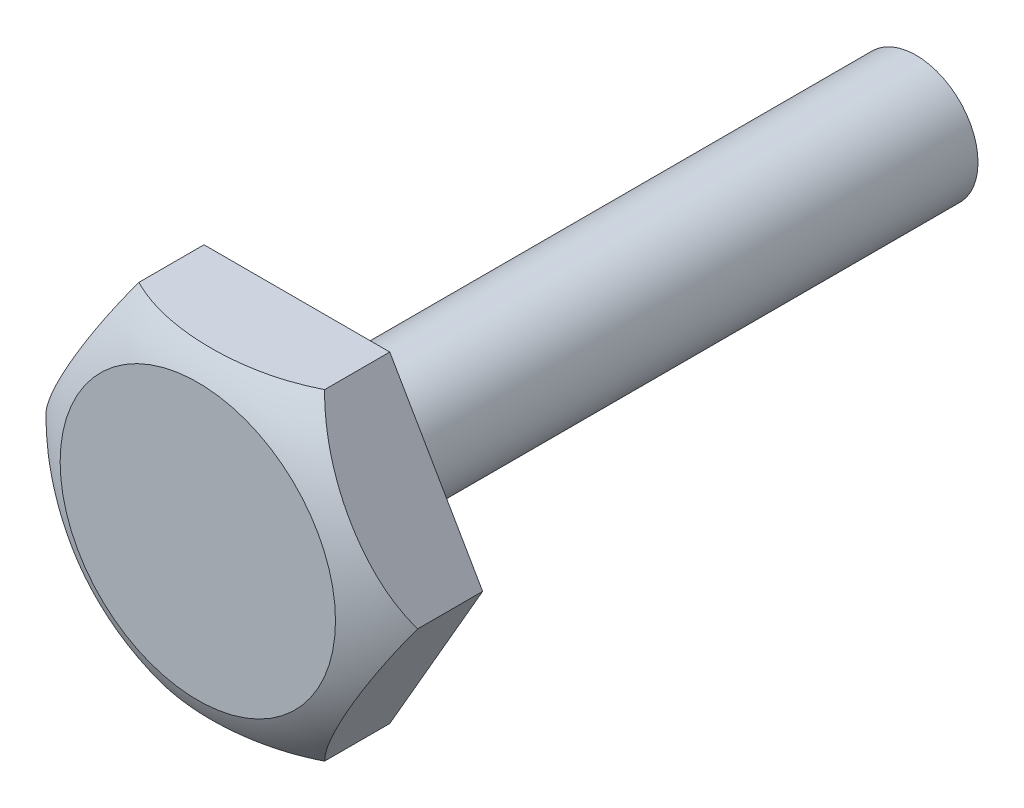
ISO-10303-21;
HEADER;
FILE_DESCRIPTION(('STEP AP214'),'2;1');
FILE_NAME('part.step','',(''),(''),'','','');
FILE_SCHEMA(('AUTOMOTIVE_DESIGN { 1 0 10303 214 1 1 1 1 }'));
ENDSEC;
DATA;
#1=APPLICATION_CONTEXT('core data for automotive mechanical design processes');
#2=APPLICATION_PROTOCOL_DEFINITION('international standard','automotive_design',2000,#1);
#3=PRODUCT_CONTEXT('',#1,'mechanical');
#4=PRODUCT('Part','Part','',(#3));
#5=PRODUCT_RELATED_PRODUCT_CATEGORY('part','',(#4));
#6=PRODUCT_DEFINITION_FORMATION('','',#4);
#7=PRODUCT_DEFINITION_CONTEXT('part definition',#1,'design');
#8=PRODUCT_DEFINITION('design','',#6,#7);
#9=PRODUCT_DEFINITION_SHAPE('','',#8);
#10=(LENGTH_UNIT() NAMED_UNIT(*) SI_UNIT(.MILLI.,.METRE.));
#11=(NAMED_UNIT(*) PLANE_ANGLE_UNIT() SI_UNIT($,.RADIAN.));
#12=(NAMED_UNIT(*) SI_UNIT($,.STERADIAN.) SOLID_ANGLE_UNIT());
#13=UNCERTAINTY_MEASURE_WITH_UNIT(LENGTH_MEASURE(1.E-05),#10,'distance_accuracy_value','');
#14=(GEOMETRIC_REPRESENTATION_CONTEXT(3) GLOBAL_UNCERTAINTY_ASSIGNED_CONTEXT((#13)) GLOBAL_UNIT_ASSIGNED_CONTEXT((#10,
#11,#12)) REPRESENTATION_CONTEXT('',''));
#15=CARTESIAN_POINT('',(0.,0.,0.));
#16=DIRECTION('',(0.,0.,1.));
#17=DIRECTION('',(1.,0.,0.));
#18=AXIS2_PLACEMENT_3D('',#15,#16,#17);
#19=CARTESIAN_POINT('',(3.75000000000008,-6.49519052838325,4.));
#20=DIRECTION('',(-0.866025403784441,0.499999999999995,0.));
#21=DIRECTION('',(-0.499999999999995,-0.866025403784442,0.));
#22=AXIS2_PLACEMENT_3D('',#19,#20,#21);
#23=PLANE('',#22);
#24=DIRECTION('',(0.,0.,-1.));
#25=VECTOR('',#24,1.);
#26=CARTESIAN_POINT('',(7.5,0.,4.));
#27=LINE('',#26,#25);
#28=CARTESIAN_POINT('',(7.49999999999999,0.,2.62939819100029));
#29=VERTEX_POINT('',#28);
#30=CARTESIAN_POINT('',(7.5,0.,0.));
#31=VERTEX_POINT('',#30);
#32=EDGE_CURVE('E11',#29,#31,#27,.T.);
#33=ORIENTED_EDGE('',*,*,#32,.F.);
#34=CARTESIAN_POINT('',(7.50011547005384,0.000199999999999211,2.62927962667923));
#35=CARTESIAN_POINT('',(7.4168632563686,-0.143997063945415,2.71476815559064));
#36=CARTESIAN_POINT('',(7.33185595866303,-0.291234022585602,2.7930783197184));
#37=CARTESIAN_POINT('',(7.1591001834199,-0.590455802607645,2.93585596921395));
#38=CARTESIAN_POINT('',(7.07135526733453,-0.742434455373376,3.00034064552003));
#39=CARTESIAN_POINT('',(6.80471411859253,-1.20427047238307,3.17420321588138));
#40=CARTESIAN_POINT('',(6.6225358274277,-1.51981252871663,3.26386574604815));
#41=CARTESIAN_POINT('',(6.30942279541368,-2.06214020867685,3.37582623012344));
#42=CARTESIAN_POINT('',(6.17948309488391,-2.28720237191471,3.41025736985663));
#43=CARTESIAN_POINT('',(5.91855813859982,-2.73913765316144,3.45715839331436));
#44=CARTESIAN_POINT('',(5.78757257588217,-2.96601130284642,3.46962157208918));
#45=CARTESIAN_POINT('',(5.52549936277508,-3.41993542325073,3.47307988867929));
#46=CARTESIAN_POINT('',(5.39441169553681,-3.6469859231531,3.46406993174504));
#47=CARTESIAN_POINT('',(5.13312913421654,-4.09954059449154,3.42420879852374));
#48=CARTESIAN_POINT('',(5.00293402120444,-4.32504514512568,3.39336318696253));
#49=CARTESIAN_POINT('',(4.67864015370606,-4.88673860021589,3.28702097901748));
#50=CARTESIAN_POINT('',(4.48562748867411,-5.2210463425555,3.19681149726034));
#51=CARTESIAN_POINT('',(4.20328912367753,-5.71007073565551,3.01784692902771));
#52=CARTESIAN_POINT('',(4.11041933985091,-5.87092591973116,2.95096292528329));
#53=CARTESIAN_POINT('',(3.927674798482,-6.18744875018799,2.80183087467424));
#54=CARTESIAN_POINT('',(3.83780440833829,-6.34310883201292,2.71956148497344));
#55=CARTESIAN_POINT('',(3.74988452994623,-6.49539052838325,2.62927962667928));
#56=B_SPLINE_CURVE_WITH_KNOTS('',3,(#34,#35,#36,#37,#38,#39,#40,#41,#42,#43,#44,#45,#46,#47,#48,
#49,#50,#51,#52,#53,#54,#55),.UNSPECIFIED.,.F.,.F.,(4,2,2,2,2,2,2,2,2,2,4),(0.,0.56107497083197,
1.12144818888939,2.24301953120071,3.0286600012569,3.81454021902151,4.60060691450929,
5.38647335625081,6.57098986097647,7.16263572576022,7.75510850182308),.UNSPECIFIED.);
#57=CARTESIAN_POINT('',(3.75000000000008,-6.49519052838325,2.62939819100028));
#58=VERTEX_POINT('',#57);
#59=EDGE_CURVE('E86',#29,#58,#56,.T.);
#60=ORIENTED_EDGE('',*,*,#59,.T.);
#61=DIRECTION('',(0.,0.,-1.));
#62=VECTOR('',#61,1.);
#63=CARTESIAN_POINT('',(3.75000000000008,-6.49519052838325,4.));
#64=LINE('',#63,#62);
#65=CARTESIAN_POINT('',(3.75000000000008,-6.49519052838325,0.));
#66=VERTEX_POINT('',#65);
#67=EDGE_CURVE('E56',#58,#66,#64,.T.);
#68=ORIENTED_EDGE('',*,*,#67,.T.);
#69=DIRECTION('',(0.499999999999995,0.866025403784441,0.));
#70=VECTOR('',#69,1.);
#71=CARTESIAN_POINT('',(3.75000000000008,-6.49519052838325,0.));
#72=LINE('',#71,#70);
#73=EDGE_CURVE('E126',#66,#31,#72,.T.);
#74=ORIENTED_EDGE('',*,*,#73,.T.);
#75=EDGE_LOOP('',(#33,#60,#68,#74));
#76=FACE_BOUND('',#75,.T.);
#77=ADVANCED_FACE('F32',(#76),#23,.F.);
#78=CARTESIAN_POINT('',(7.5,0.,4.));
#79=DIRECTION('',(-0.866025403784438,-0.500000000000001,0.));
#80=DIRECTION('',(0.500000000000001,-0.866025403784438,0.));
#81=AXIS2_PLACEMENT_3D('',#78,#79,#80);
#82=PLANE('',#81);
#83=DIRECTION('',(0.,0.,-1.));
#84=VECTOR('',#83,1.);
#85=CARTESIAN_POINT('',(3.74999999999998,6.4951905283833,4.));
#86=LINE('',#85,#84);
#87=CARTESIAN_POINT('',(3.75000000000342,6.4951905283833,2.62939819099851));
#88=VERTEX_POINT('',#87);
#89=CARTESIAN_POINT('',(3.74999999999998,6.4951905283833,0.));
#90=VERTEX_POINT('',#89);
#91=EDGE_CURVE('E41',#88,#90,#86,.T.);
#92=ORIENTED_EDGE('',*,*,#91,.F.);
#93=CARTESIAN_POINT('',(3.74988452994615,6.4953905283833,2.62927962667923));
#94=CARTESIAN_POINT('',(3.83313674363139,6.35119346443788,2.71476815559064));
#95=CARTESIAN_POINT('',(3.91814404133696,6.2039565057977,2.7930783197184));
#96=CARTESIAN_POINT('',(4.09089981658008,5.90473472577566,2.93585596921396));
#97=CARTESIAN_POINT('',(4.17864473266545,5.75275607300993,3.00034064552004));
#98=CARTESIAN_POINT('',(4.44528588140746,5.29092005600024,3.17420321588138));
#99=CARTESIAN_POINT('',(4.62746417257229,4.97537799966668,3.26386574604816));
#100=CARTESIAN_POINT('',(4.94057720458632,4.43305031970645,3.37582623012345));
#101=CARTESIAN_POINT('',(5.07051690511609,4.20798815646859,3.41025736985664));
#102=CARTESIAN_POINT('',(5.33144186140018,3.75605287522187,3.45715839331438));
#103=CARTESIAN_POINT('',(5.46242742411784,3.52917922553688,3.4696215720892));
#104=CARTESIAN_POINT('',(5.72450063722493,3.07525510513258,3.47307988867931));
#105=CARTESIAN_POINT('',(5.8555883044632,2.84820460523021,3.46406993174506));
#106=CARTESIAN_POINT('',(6.11687086578347,2.39564993389177,3.42420879852376));
#107=CARTESIAN_POINT('',(6.24706597879558,2.17014538325763,3.39336318696255));
#108=CARTESIAN_POINT('',(6.57135984629397,1.60845192816741,3.2870209790175));
#109=CARTESIAN_POINT('',(6.76437251132593,1.27414418582779,3.19681149726036));
#110=CARTESIAN_POINT('',(7.04671087632252,0.78511979272776,3.01784692902772));
#111=CARTESIAN_POINT('',(7.13958066014915,0.62426460865211,2.9509629252833));
#112=CARTESIAN_POINT('',(7.32232520151807,0.307741778195267,2.80183087467425));
#113=CARTESIAN_POINT('',(7.41219559166178,0.152081696370327,2.71956148497344));
#114=CARTESIAN_POINT('',(7.50011547005384,-0.000200000000005981,2.62927962667928));
#115=B_SPLINE_CURVE_WITH_KNOTS('',3,(#93,#94,#95,#96,#97,#98,#99,#100,#101,#102,#103,#104,#105,
#106,#107,#108,#109,#110,#111,#112,#113,#114),.UNSPECIFIED.,.F.,.F.,(4,2,2,2,2,2,2,2,2,2,4),(0.,
0.561074970831971,1.12144818888939,2.24301953120071,3.02866000125691,3.81454021902152,
4.6006069145093,5.38647335625082,6.57098986097653,7.1626357257603,7.75510850182317),.UNSPECIFIED.);
#116=EDGE_CURVE('E93',#88,#29,#115,.T.);
#117=ORIENTED_EDGE('',*,*,#116,.T.);
#118=ORIENTED_EDGE('',*,*,#32,.T.);
#119=DIRECTION('',(-0.500000000000001,0.866025403784438,0.));
#120=VECTOR('',#119,1.);
#121=CARTESIAN_POINT('',(7.5,0.,0.));
#122=LINE('',#121,#120);
#123=EDGE_CURVE('E123',#31,#90,#122,.T.);
#124=ORIENTED_EDGE('',*,*,#123,.T.);
#125=EDGE_LOOP('',(#92,#117,#118,#124));
#126=FACE_BOUND('',#125,.T.);
#127=ADVANCED_FACE('F124',(#126),#82,.F.);
#128=CARTESIAN_POINT('',(3.74999999999998,6.4951905283833,4.));
#129=DIRECTION('',(0.,-1.,0.));
#130=DIRECTION('',(1.,0.,0.));
#131=AXIS2_PLACEMENT_3D('',#128,#129,#130);
#132=PLANE('',#131);
#133=DIRECTION('',(0.,0.,-1.));
#134=VECTOR('',#133,1.);
#135=CARTESIAN_POINT('',(-3.75000000000003,6.49519052838327,4.));
#136=LINE('',#135,#134);
#137=CARTESIAN_POINT('',(-3.75000000000004,6.49519052838326,2.62939819100029));
#138=VERTEX_POINT('',#137);
#139=CARTESIAN_POINT('',(-3.75000000000003,6.49519052838327,0.));
#140=VERTEX_POINT('',#139);
#141=EDGE_CURVE('E108',#138,#140,#136,.T.);
#142=ORIENTED_EDGE('',*,*,#141,.F.);
#143=CARTESIAN_POINT('',(0.,6.49519093423517,3.47155890128882));
#144=CARTESIAN_POINT('',(0.258969069792951,6.49519095337973,3.47155999350398));
#145=CARTESIAN_POINT('',(0.517955469303354,6.49519064467397,3.46107347610297));
#146=CARTESIAN_POINT('',(1.03411664575157,6.49519041206603,3.41872197818895));
#147=CARTESIAN_POINT('',(1.29129099515404,6.49519048825179,3.38685211260991));
#148=CARTESIAN_POINT('',(2.05567587491364,6.49519060828818,3.25752979588181));
#149=CARTESIAN_POINT('',(2.55808633477236,6.49519054526005,3.12638360706249));
#150=CARTESIAN_POINT('',(3.36177602403168,6.49519051717013,2.82216023809037));
#151=CARTESIAN_POINT('',(3.67397173256815,6.49519052633035,2.67792383583159));
#152=CARTESIAN_POINT('',(4.12186351488053,6.49519052941038,2.42547609187166));
#153=CARTESIAN_POINT('',(4.26780050577975,6.49519052865854,2.33527939174894));
#154=CARTESIAN_POINT('',(4.55144143610393,6.49519052810818,2.14280520622689));
#155=CARTESIAN_POINT('',(4.68914872378271,6.49519052830926,2.04053268496893));
#156=CARTESIAN_POINT('',(4.95611129637003,6.49519052845804,1.82302204747028));
#157=CARTESIAN_POINT('',(5.08527451851943,6.49519052840332,1.70767064563135));
#158=CARTESIAN_POINT('',(5.33204681255794,6.49519052836329,1.46530046963495));
#159=CARTESIAN_POINT('',(5.4496619593104,6.49519052837794,1.33828789862349));
#160=CARTESIAN_POINT('',(5.67180550403882,6.49519052838866,1.07329808959834));
#161=CARTESIAN_POINT('',(5.77633560552021,6.49519052838474,0.935322282689017));
#162=CARTESIAN_POINT('',(5.97079000768911,6.49519052838188,0.649438013516897));
#163=CARTESIAN_POINT('',(6.06071690611299,6.49519052838295,0.501531324471366));
#164=CARTESIAN_POINT('',(6.21332623462655,6.49519052838362,0.218030290201649));
#165=CARTESIAN_POINT('',(6.27805408110452,6.49519052838339,0.0835335692056448));
#166=CARTESIAN_POINT('',(6.39483489630915,6.49519052838323,-0.190849110927465));
#167=CARTESIAN_POINT('',(6.44688953267615,6.49519052838329,-0.330734358191222));
#168=CARTESIAN_POINT('',(6.53765454962487,6.49519052838333,-0.614689934226276));
#169=CARTESIAN_POINT('',(6.57637199741855,6.49519052838331,-0.758758002552336));
#170=CARTESIAN_POINT('',(6.64000402939573,6.4951905283833,-1.04991067649231));
#171=CARTESIAN_POINT('',(6.66491951013604,6.49519052838331,-1.19699508552506));
#172=CARTESIAN_POINT('',(6.69891588385024,6.49519052838331,-1.47868187709908));
#173=CARTESIAN_POINT('',(6.70928493807464,6.49519052838331,-1.61313033018025));
#174=CARTESIAN_POINT('',(6.71836976532784,6.49519052838331,-1.88246747303089));
#175=CARTESIAN_POINT('',(6.71708184497079,6.49519052838331,-2.01735628879163));
#176=CARTESIAN_POINT('',(6.7028604172302,6.49519052838331,-2.28643552133006));
#177=CARTESIAN_POINT('',(6.68993393069983,6.49519052838331,-2.42062631010796));
#178=CARTESIAN_POINT('',(6.65257883256612,6.49519052838331,-2.68744506090726));
#179=CARTESIAN_POINT('',(6.62814598083905,6.49519052838331,-2.82007242832113));
#180=CARTESIAN_POINT('',(6.56873956440933,6.49519052838331,-3.07966039288273));
#181=CARTESIAN_POINT('',(6.53402789892812,6.49519052838331,-3.20668088128766));
#182=CARTESIAN_POINT('',(6.45423458727956,6.49519052838331,-3.45743670218484));
#183=CARTESIAN_POINT('',(6.40914927739043,6.49519052838331,-3.58117085676076));
#184=CARTESIAN_POINT('',(6.25897532464976,6.49519052838331,-3.94613733601996));
#185=CARTESIAN_POINT('',(6.13891041249786,6.49519052838331,-4.18138488363264));
#186=CARTESIAN_POINT('',(5.85898094454624,6.49519052838331,-4.63721546700034));
#187=CARTESIAN_POINT('',(5.69795276567298,6.49519052838331,-4.85707627528596));
#188=CARTESIAN_POINT('',(5.34404693994348,6.4951905283833,-5.26938988649425));
#189=CARTESIAN_POINT('',(5.15116207403538,6.4951905283833,-5.46183645861714));
#190=CARTESIAN_POINT('',(4.72135130436639,6.4951905283833,-5.83277671193754));
#191=CARTESIAN_POINT('',(4.48202861756665,6.4951905283833,-6.00847921869226));
#192=CARTESIAN_POINT('',(3.98067346222279,6.4951905283833,-6.32372280388448));
#193=CARTESIAN_POINT('',(3.71862865093404,6.4951905283833,-6.46324406224017));
#194=CARTESIAN_POINT('',(3.2497105645913,6.4951905283833,-6.6751852391368));
#195=CARTESIAN_POINT('',(3.04637143158018,6.4951905283833,-6.75560831776356));
#196=CARTESIAN_POINT('',(2.63334565741563,6.49519052838329,-6.89831708459762));
#197=CARTESIAN_POINT('',(2.42365641031326,6.49519052838329,-6.96059521203973));
#198=CARTESIAN_POINT('',(1.99951909872226,6.49519052838329,-7.06811016100649));
#199=CARTESIAN_POINT('',(1.78506172387453,6.49519052838329,-7.11330983943059));
#200=CARTESIAN_POINT('',(1.35340584292705,6.49519052838329,-7.18748807411325));
#201=CARTESIAN_POINT('',(1.13620756418126,6.49519052838329,-7.21646796685261));
#202=CARTESIAN_POINT('',(0.695251142518523,6.49519052838329,-7.25948213161412));
#203=CARTESIAN_POINT('',(0.471457878176939,6.49519052838329,-7.27315331616981));
#204=CARTESIAN_POINT('',(0.0234585767996498,6.49519052838329,-7.28475860551752));
#205=CARTESIAN_POINT('',(-0.200747489936709,6.49519052838328,-7.28269152988778));
#206=CARTESIAN_POINT('',(-0.648323624051078,6.49519052838328,-7.26275131522971));
#207=CARTESIAN_POINT('',(-0.871694178721984,6.49519052838328,-7.24488960705426));
#208=CARTESIAN_POINT('',(-1.31643539871702,6.49519052838328,-7.1928606882892));
#209=CARTESIAN_POINT('',(-1.53780634573541,6.49519052838328,-7.15869581209195));
#210=CARTESIAN_POINT('',(-2.14405397389793,6.49519052838328,-7.0406109669356));
#211=CARTESIAN_POINT('',(-2.52577049350673,6.49519052838328,-6.93860543822306));
#212=CARTESIAN_POINT('',(-3.08208383166056,6.49519052838327,-6.7413229405459));
#213=CARTESIAN_POINT('',(-3.26475515061295,6.49519052838327,-6.66821374208926));
#214=CARTESIAN_POINT('',(-3.62318684535136,6.49519052838327,-6.50654858417446));
#215=CARTESIAN_POINT('',(-3.79894868736599,6.49519052838327,-6.41799592382293));
#216=CARTESIAN_POINT('',(-4.10897885662405,6.49519052838327,-6.24340769582508));
#217=CARTESIAN_POINT('',(-4.24478435859038,6.49519052838327,-6.16009258870633));
#218=CARTESIAN_POINT('',(-4.50940288339863,6.49519052838327,-5.98302775712828));
#219=CARTESIAN_POINT('',(-4.63821740337608,6.49519052838327,-5.88928028000844));
#220=CARTESIAN_POINT('',(-4.88771197312812,6.49519052838327,-5.69141266820533));
#221=CARTESIAN_POINT('',(-5.00838907411993,6.49519052838327,-5.58728880690669));
#222=CARTESIAN_POINT('',(-5.24025659129471,6.49519052838327,-5.36905169783457));
#223=CARTESIAN_POINT('',(-5.35145162164464,6.49519052838327,-5.25494336411499));
#224=CARTESIAN_POINT('',(-5.56393235309432,6.49519052838327,-5.01635043616324));
#225=CARTESIAN_POINT('',(-5.66514122996496,6.49519052838327,-4.89179726632481));
#226=CARTESIAN_POINT('',(-5.85545126302382,6.49519052838327,-4.63383442562589));
#227=CARTESIAN_POINT('',(-5.94455810667546,6.49519052838326,-4.50042895917169));
#228=CARTESIAN_POINT('',(-6.10954943152176,6.49519052838326,-4.22569052279737));
#229=CARTESIAN_POINT('',(-6.18543573307253,6.49519052838326,-4.08435864782442));
#230=CARTESIAN_POINT('',(-6.32295532458061,6.49519052838326,-3.79492608931995));
#231=CARTESIAN_POINT('',(-6.38459049083543,6.49519052838326,-3.64682629992724));
#232=CARTESIAN_POINT('',(-6.48642538056149,6.49519052838326,-3.36281902467063));
#233=CARTESIAN_POINT('',(-6.52828707440957,6.49519052838326,-3.22750519724051));
#234=CARTESIAN_POINT('',(-6.59975254584516,6.49519052838326,-2.95362135328283));
#235=CARTESIAN_POINT('',(-6.62935231232609,6.49519052838326,-2.81505028689088));
#236=CARTESIAN_POINT('',(-6.67590692428075,6.49519052838326,-2.53591061228801));
#237=CARTESIAN_POINT('',(-6.69287158841637,6.49519052838326,-2.39534364183388));
#238=CARTESIAN_POINT('',(-6.71399735555781,6.49519052838326,-2.11319599099732));
#239=CARTESIAN_POINT('',(-6.7181538906705,6.49519052838326,-1.97161496700192));
#240=CARTESIAN_POINT('',(-6.71374732339712,6.49519052838326,-1.69766928962382));
#241=CARTESIAN_POINT('',(-6.7059764429994,6.49519052838326,-1.56529121230037));
#242=CARTESIAN_POINT('',(-6.679232610204,6.49519052838327,-1.30162387859523));
#243=CARTESIAN_POINT('',(-6.66025577658161,6.49519052838328,-1.17033501545106));
#244=CARTESIAN_POINT('',(-6.61130509440032,6.49519052838324,-0.909895844195871));
#245=CARTESIAN_POINT('',(-6.58133688326408,6.49519052838319,-0.780744475201743));
#246=CARTESIAN_POINT('',(-6.51069660081557,6.49519052838334,-0.525356081721695));
#247=CARTESIAN_POINT('',(-6.47002053970753,6.49519052838354,-0.399120162656735));
#248=CARTESIAN_POINT('',(-6.37841813942033,6.49519052838299,-0.150570651755468));
#249=CARTESIAN_POINT('',(-6.32750256686276,6.49519052838223,-0.0282530951660894));
#250=CARTESIAN_POINT('',(-6.21589504006344,6.4951905283843,0.211853904525445));
#251=CARTESIAN_POINT('',(-6.15519960218179,6.49519052838713,0.329641715520424));
#252=CARTESIAN_POINT('',(-5.9592957298671,6.49519052837554,0.67508453494386));
#253=CARTESIAN_POINT('',(-5.8101907795019,6.49519052834108,0.895030790938366));
#254=CARTESIAN_POINT('',(-5.47157501216978,6.4951905284277,1.32059888779114));
#255=CARTESIAN_POINT('',(-5.28033163723046,6.49519052855717,1.52482851235643));
#256=CARTESIAN_POINT('',(-4.86943819780228,6.49519052820932,1.90224355175657));
#257=CARTESIAN_POINT('',(-4.64978028087344,6.49519052773183,2.0754203533695));
#258=CARTESIAN_POINT('',(-4.16199366567586,6.49519052911002,2.40777952145206));
#259=CARTESIAN_POINT('',(-3.89119711364582,6.49519053124179,2.56302988997838));
#260=CARTESIAN_POINT('',(-3.33083143935254,6.49519052552305,2.83437347560129));
#261=CARTESIAN_POINT('',(-3.04125124378215,6.4951905176666,2.95044334030363));
#262=CARTESIAN_POINT('',(-2.30493968614458,6.49519054435201,3.19397967667186));
#263=CARTESIAN_POINT('',(-1.8507428850566,6.49519060155952,3.29915368415554));
#264=CARTESIAN_POINT('',(-1.16158809674743,6.49519049164225,3.40317204053026));
#265=CARTESIAN_POINT('',(-0.930070910148221,6.49519042203226,3.42888484271053));
#266=CARTESIAN_POINT('',(-0.465707112361374,6.49519063472948,3.4630773910584));
#267=CARTESIAN_POINT('',(-0.23286056197811,6.49519091702072,3.47155791918762));
#268=CARTESIAN_POINT('',(0.,6.49519093423517,3.47155890128882));
#269=B_SPLINE_CURVE_WITH_KNOTS('',3,(#143,#144,#145,#146,#147,#148,#149,#150,#151,#152,#153,
#154,#155,#156,#157,#158,#159,#160,#161,#162,#163,#164,#165,#166,#167,#168,#169,#170,#171,#172,
#173,#174,#175,#176,#177,#178,#179,#180,#181,#182,#183,#184,#185,#186,#187,#188,#189,#190,#191,
#192,#193,#194,#195,#196,#197,#198,#199,#200,#201,#202,#203,#204,#205,#206,#207,#208,#209,#210,
#211,#212,#213,#214,#215,#216,#217,#218,#219,#220,#221,#222,#223,#224,#225,#226,#227,#228,#229,
#230,#231,#232,#233,#234,#235,#236,#237,#238,#239,#240,#241,#242,#243,#244,#245,#246,#247,#248,
#249,#250,#251,#252,#253,#254,#255,#256,#257,#258,#259,#260,#261,#262,#263,#264,#265,#266,#267,
#268),.UNSPECIFIED.,.T.,.F.,(4,2,2,2,2,2,2,2,2,2,2,2,2,2,2,2,2,2,2,2,2,2,2,2,2,2,2,2,2,2,2,2,2,
2,2,2,2,2,2,2,2,2,2,2,2,2,2,2,2,2,2,2,2,2,2,2,2,2,2,2,2,2,4),(0.,0.776652094276429,
1.55348167662068,3.1002088513003,4.12787714076711,4.64201462740926,5.15594149291401,
5.6747200261617,6.193224177226,6.71166075532702,7.2300050084534,7.67718284563839,
8.12430180781463,8.5711834813934,9.01803612274796,9.42208540946644,9.82626271929519,
10.2301963762821,10.6342790004226,11.0288415073095,11.4235435786657,12.2121834288833,
13.0263790023942,13.8407593347621,14.728040932914,15.6158075619041,16.2709654950617,
16.9263960348517,17.5832439446481,18.2400377234022,18.9120993913612,19.5842114666727,
20.2558375204128,20.9273674352618,22.107548915719,22.6972599043448,23.2868450700402,
23.7643719978953,24.2417962553871,24.7193925991098,25.1967551925475,25.6775428792768,
26.1581038276594,26.6385985545028,27.1190299835768,27.5434048251576,27.9679183783025,
28.3921016993389,28.8164362836823,29.2137808890204,29.6112631969672,30.0085419226647,
30.4059688863408,30.8029801288618,31.2001331027973,31.9937686535172,32.8297864954876,
33.6660358689334,34.5989559376517,35.5324310683581,36.9233858630535,37.6217698456402,
38.320122136434),.UNSPECIFIED.);
#270=EDGE_CURVE('E120',#138,#88,#269,.T.);
#271=ORIENTED_EDGE('',*,*,#270,.T.);
#272=ORIENTED_EDGE('',*,*,#91,.T.);
#273=DIRECTION('',(-1.,0.,0.));
#274=VECTOR('',#273,1.);
#275=CARTESIAN_POINT('',(3.74999999999998,6.4951905283833,0.));
#276=LINE('',#275,#274);
#277=EDGE_CURVE('E118',#90,#140,#276,.T.);
#278=ORIENTED_EDGE('',*,*,#277,.T.);
#279=EDGE_LOOP('',(#142,#271,#272,#278));
#280=FACE_BOUND('',#279,.T.);
#281=ADVANCED_FACE('F116',(#280),#132,.F.);
#282=CARTESIAN_POINT('',(-3.75000000000003,6.49519052838327,4.));
#283=DIRECTION('',(0.866025403784442,-0.499999999999995,0.));
#284=DIRECTION('',(0.499999999999995,0.866025403784442,0.));
#285=AXIS2_PLACEMENT_3D('',#282,#283,#284);
#286=PLANE('',#285);
#287=DIRECTION('',(0.,0.,-1.));
#288=VECTOR('',#287,1.);
#289=CARTESIAN_POINT('',(-7.5,0.,4.));
#290=LINE('',#289,#288);
#291=CARTESIAN_POINT('',(-7.49999999999999,0.,2.62939819100029));
#292=VERTEX_POINT('',#291);
#293=CARTESIAN_POINT('',(-7.5,0.,0.));
#294=VERTEX_POINT('',#293);
#295=EDGE_CURVE('E101',#292,#294,#290,.T.);
#296=ORIENTED_EDGE('',*,*,#295,.F.);
#297=CARTESIAN_POINT('',(-7.50011547005384,-0.000200000000051757,2.62927962667923));
#298=CARTESIAN_POINT('',(-7.4168632563686,0.143997063945362,2.71476815559064));
#299=CARTESIAN_POINT('',(-7.33185595866303,0.291234022585548,2.7930783197184));
#300=CARTESIAN_POINT('',(-7.1591001834199,0.59045580260759,2.93585596921396));
#301=CARTESIAN_POINT('',(-7.07135526733453,0.742434455373322,3.00034064552004));
#302=CARTESIAN_POINT('',(-6.80471411859253,1.20427047238301,3.17420321588138));
#303=CARTESIAN_POINT('',(-6.6225358274277,1.51981252871657,3.26386574604816));
#304=CARTESIAN_POINT('',(-6.30942279541368,2.0621402086768,3.37582623012345));
#305=CARTESIAN_POINT('',(-6.17948309488391,2.28720237191466,3.41025736985664));
#306=CARTESIAN_POINT('',(-5.91855813859982,2.73913765316139,3.45715839331438));
#307=CARTESIAN_POINT('',(-5.78757257588217,2.96601130284637,3.4696215720892));
#308=CARTESIAN_POINT('',(-5.52549936277508,3.41993542325068,3.47307988867931));
#309=CARTESIAN_POINT('',(-5.39441169553681,3.64698592315305,3.46406993174505));
#310=CARTESIAN_POINT('',(-5.13312913421654,4.09954059449149,3.42420879852376));
#311=CARTESIAN_POINT('',(-5.00293402120443,4.32504514512563,3.39336318696255));
#312=CARTESIAN_POINT('',(-4.67864015370605,4.88673860021586,3.2870209790175));
#313=CARTESIAN_POINT('',(-4.48562748867409,5.22104634255548,3.19681149726036));
#314=CARTESIAN_POINT('',(-4.2032891236775,5.71007073565551,3.01784692902772));
#315=CARTESIAN_POINT('',(-4.11041933985088,5.87092591973116,2.9509629252833));
#316=CARTESIAN_POINT('',(-3.92767479848196,6.18744875018801,2.80183087467425));
#317=CARTESIAN_POINT('',(-3.83780440833825,6.34310883201295,2.71956148497344));
#318=CARTESIAN_POINT('',(-3.74988452994619,6.49539052838328,2.62927962667928));
#319=B_SPLINE_CURVE_WITH_KNOTS('',3,(#297,#298,#299,#300,#301,#302,#303,#304,#305,#306,#307,
#308,#309,#310,#311,#312,#313,#314,#315,#316,#317,#318),.UNSPECIFIED.,.F.,.F.,(4,2,2,2,2,2,2,2,
2,2,4),(0.,0.56107497083197,1.12144818888939,2.24301953120071,3.0286600012569,3.81454021902152,
4.6006069145093,5.38647335625082,6.57098986097653,7.1626357257603,7.75510850182317),.UNSPECIFIED.);
#320=EDGE_CURVE('E174',#292,#138,#319,.T.);
#321=ORIENTED_EDGE('',*,*,#320,.T.);
#322=ORIENTED_EDGE('',*,*,#141,.T.);
#323=DIRECTION('',(-0.499999999999995,-0.866025403784442,0.));
#324=VECTOR('',#323,1.);
#325=CARTESIAN_POINT('',(-3.75000000000003,6.49519052838327,0.));
#326=LINE('',#325,#324);
#327=EDGE_CURVE('E131',#140,#294,#326,.T.);
#328=ORIENTED_EDGE('',*,*,#327,.T.);
#329=EDGE_LOOP('',(#296,#321,#322,#328));
#330=FACE_BOUND('',#329,.T.);
#331=ADVANCED_FACE('F184',(#330),#286,.F.);
#332=CARTESIAN_POINT('',(-7.5,0.,4.));
#333=DIRECTION('',(0.866025403784434,0.500000000000007,0.));
#334=DIRECTION('',(-0.500000000000007,0.866025403784435,0.));
#335=AXIS2_PLACEMENT_3D('',#332,#333,#334);
#336=PLANE('',#335);
#337=DIRECTION('',(0.,0.,-1.));
#338=VECTOR('',#337,1.);
#339=CARTESIAN_POINT('',(-3.74999999999994,-6.49519052838332,4.));
#340=LINE('',#339,#338);
#341=CARTESIAN_POINT('',(-3.74999999999994,-6.49519052838332,2.62939819099851));
#342=VERTEX_POINT('',#341);
#343=CARTESIAN_POINT('',(-3.74999999999994,-6.49519052838332,0.));
#344=VERTEX_POINT('',#343);
#345=EDGE_CURVE('E99',#342,#344,#340,.T.);
#346=ORIENTED_EDGE('',*,*,#345,.F.);
#347=CARTESIAN_POINT('',(-3.7498845299461,-6.49539052838332,2.62927962667923));
#348=CARTESIAN_POINT('',(-3.83313674363134,-6.35119346443791,2.71476815559064));
#349=CARTESIAN_POINT('',(-3.91814404133691,-6.20395650579773,2.7930783197184));
#350=CARTESIAN_POINT('',(-4.09089981658004,-5.90473472577569,2.93585596921396));
#351=CARTESIAN_POINT('',(-4.17864473266541,-5.75275607300996,3.00034064552004));
#352=CARTESIAN_POINT('',(-4.44528588140743,-5.29092005600027,3.17420321588138));
#353=CARTESIAN_POINT('',(-4.62746417257226,-4.97537799966671,3.26386574604816));
#354=CARTESIAN_POINT('',(-4.94057720458628,-4.43305031970649,3.37582623012345));
#355=CARTESIAN_POINT('',(-5.07051690511606,-4.20798815646863,3.41025736985664));
#356=CARTESIAN_POINT('',(-5.33144186140015,-3.75605287522191,3.45715839331438));
#357=CARTESIAN_POINT('',(-5.46242742411781,-3.52917922553692,3.4696215720892));
#358=CARTESIAN_POINT('',(-5.7245006372249,-3.07525510513262,3.47307988867931));
#359=CARTESIAN_POINT('',(-5.85558830446318,-2.84820460523025,3.46406993174506));
#360=CARTESIAN_POINT('',(-6.11687086578346,-2.39564993389181,3.42420879852376));
#361=CARTESIAN_POINT('',(-6.24706597879556,-2.17014538325767,3.39336318696255));
#362=CARTESIAN_POINT('',(-6.57135984629396,-1.60845192816745,3.2870209790175));
#363=CARTESIAN_POINT('',(-6.76437251132592,-1.27414418582783,3.19681149726036));
#364=CARTESIAN_POINT('',(-7.04671087632252,-0.785119792727808,3.01784692902772));
#365=CARTESIAN_POINT('',(-7.13958066014914,-0.624264608652159,2.9509629252833));
#366=CARTESIAN_POINT('',(-7.32232520151807,-0.307741778195317,2.80183087467425));
#367=CARTESIAN_POINT('',(-7.41219559166178,-0.152081696370378,2.71956148497344));
#368=CARTESIAN_POINT('',(-7.50011547005384,0.000199999999954142,2.62927962667928));
#369=B_SPLINE_CURVE_WITH_KNOTS('',3,(#347,#348,#349,#350,#351,#352,#353,#354,#355,#356,#357,
#358,#359,#360,#361,#362,#363,#364,#365,#366,#367,#368),.UNSPECIFIED.,.F.,.F.,(4,2,2,2,2,2,2,2,
2,2,4),(0.,0.56107497083197,1.12144818888939,2.24301953120071,3.0286600012569,3.81454021902152,
4.6006069145093,5.38647335625082,6.57098986097653,7.1626357257603,7.75510850182317),.UNSPECIFIED.);
#370=EDGE_CURVE('E48',#342,#292,#369,.T.);
#371=ORIENTED_EDGE('',*,*,#370,.T.);
#372=ORIENTED_EDGE('',*,*,#295,.T.);
#373=DIRECTION('',(0.500000000000007,-0.866025403784435,0.));
#374=VECTOR('',#373,1.);
#375=CARTESIAN_POINT('',(-7.5,0.,0.));
#376=LINE('',#375,#374);
#377=EDGE_CURVE('E103',#294,#344,#376,.T.);
#378=ORIENTED_EDGE('',*,*,#377,.T.);
#379=EDGE_LOOP('',(#346,#371,#372,#378));
#380=FACE_BOUND('',#379,.T.);
#381=ADVANCED_FACE('F137',(#380),#336,.F.);
#382=CARTESIAN_POINT('',(-3.74999999999994,-6.49519052838332,4.));
#383=DIRECTION('',(0.,1.,0.));
#384=DIRECTION('',(-1.,0.,0.));
#385=AXIS2_PLACEMENT_3D('',#382,#383,#384);
#386=PLANE('',#385);
#387=ORIENTED_EDGE('',*,*,#67,.F.);
#388=CARTESIAN_POINT('',(0.,-6.49519093423517,3.47155890128882));
#389=CARTESIAN_POINT('',(-0.258969069792905,-6.49519095337973,3.47155999350398));
#390=CARTESIAN_POINT('',(-0.517955469303308,-6.49519064467398,3.46107347610297));
#391=CARTESIAN_POINT('',(-1.03411664575152,-6.49519041206603,3.41872197818895));
#392=CARTESIAN_POINT('',(-1.291290995154,-6.4951904882518,3.38685211260991));
#393=CARTESIAN_POINT('',(-2.05567587491359,-6.49519060828819,3.25752979588181));
#394=CARTESIAN_POINT('',(-2.55808633477231,-6.49519054526006,3.12638360706249));
#395=CARTESIAN_POINT('',(-3.36177602403163,-6.49519051717016,2.82216023809037));
#396=CARTESIAN_POINT('',(-3.67397173256811,-6.49519052633038,2.67792383583159));
#397=CARTESIAN_POINT('',(-4.12186351488049,-6.49519052941041,2.42547609187166));
#398=CARTESIAN_POINT('',(-4.2678005057797,-6.49519052865857,2.33527939174894));
#399=CARTESIAN_POINT('',(-4.55144143610388,-6.49519052810821,2.14280520622689));
#400=CARTESIAN_POINT('',(-4.68914872378267,-6.49519052830929,2.04053268496893));
#401=CARTESIAN_POINT('',(-4.95611129636999,-6.49519052845808,1.82302204747028));
#402=CARTESIAN_POINT('',(-5.08527451851938,-6.49519052840336,1.70767064563135));
#403=CARTESIAN_POINT('',(-5.3320468125579,-6.49519052836333,1.46530046963495));
#404=CARTESIAN_POINT('',(-5.44966195931036,-6.49519052837798,1.33828789862349));
#405=CARTESIAN_POINT('',(-5.67180550403878,-6.4951905283887,1.07329808959834));
#406=CARTESIAN_POINT('',(-5.77633560552017,-6.49519052838478,0.935322282689015));
#407=CARTESIAN_POINT('',(-5.97079000768907,-6.49519052838192,0.649438013516894));
#408=CARTESIAN_POINT('',(-6.06071690611294,-6.49519052838299,0.501531324471363));
#409=CARTESIAN_POINT('',(-6.21332623462651,-6.49519052838366,0.218030290201645));
#410=CARTESIAN_POINT('',(-6.27805408110448,-6.49519052838343,0.0835335692056423));
#411=CARTESIAN_POINT('',(-6.3948348963091,-6.49519052838327,-0.190849110927467));
#412=CARTESIAN_POINT('',(-6.4468895326761,-6.49519052838333,-0.330734358191224));
#413=CARTESIAN_POINT('',(-6.53765454962482,-6.49519052838338,-0.614689934226279));
#414=CARTESIAN_POINT('',(-6.5763719974185,-6.49519052838336,-0.758758002552338));
#415=CARTESIAN_POINT('',(-6.64000402939569,-6.49519052838335,-1.04991067649231));
#416=CARTESIAN_POINT('',(-6.66491951013599,-6.49519052838335,-1.19699508552506));
#417=CARTESIAN_POINT('',(-6.69891588385019,-6.49519052838336,-1.47868187709908));
#418=CARTESIAN_POINT('',(-6.7092849380746,-6.49519052838336,-1.61313033018025));
#419=CARTESIAN_POINT('',(-6.71836976532779,-6.49519052838336,-1.88246747303089));
#420=CARTESIAN_POINT('',(-6.71708184497074,-6.49519052838336,-2.01735628879164));
#421=CARTESIAN_POINT('',(-6.70286041723016,-6.49519052838336,-2.28643552133006));
#422=CARTESIAN_POINT('',(-6.68993393069979,-6.49519052838335,-2.42062631010796));
#423=CARTESIAN_POINT('',(-6.65257883256607,-6.49519052838335,-2.68744506090727));
#424=CARTESIAN_POINT('',(-6.628145980839,-6.49519052838335,-2.82007242832114));
#425=CARTESIAN_POINT('',(-6.56873956440929,-6.49519052838335,-3.07966039288273));
#426=CARTESIAN_POINT('',(-6.53402789892808,-6.49519052838335,-3.20668088128767));
#427=CARTESIAN_POINT('',(-6.45423458727952,-6.49519052838335,-3.45743670218484));
#428=CARTESIAN_POINT('',(-6.40914927739039,-6.49519052838335,-3.58117085676076));
#429=CARTESIAN_POINT('',(-6.25897532464972,-6.49519052838335,-3.94613733601996));
#430=CARTESIAN_POINT('',(-6.13891041249782,-6.49519052838335,-4.18138488363264));
#431=CARTESIAN_POINT('',(-5.8589809445462,-6.49519052838335,-4.63721546700034));
#432=CARTESIAN_POINT('',(-5.69795276567294,-6.49519052838334,-4.85707627528596));
#433=CARTESIAN_POINT('',(-5.34404693994343,-6.49519052838334,-5.26938988649425));
#434=CARTESIAN_POINT('',(-5.15116207403534,-6.49519052838334,-5.46183645861714));
#435=CARTESIAN_POINT('',(-4.72135130436634,-6.49519052838334,-5.83277671193754));
#436=CARTESIAN_POINT('',(-4.48202861756661,-6.49519052838333,-6.00847921869226));
#437=CARTESIAN_POINT('',(-3.98067346222274,-6.49519052838333,-6.32372280388448));
#438=CARTESIAN_POINT('',(-3.71862865093399,-6.49519052838332,-6.46324406224017));
#439=CARTESIAN_POINT('',(-3.24971056459126,-6.49519052838332,-6.6751852391368));
#440=CARTESIAN_POINT('',(-3.04637143158014,-6.49519052838332,-6.75560831776356));
#441=CARTESIAN_POINT('',(-2.63334565741559,-6.49519052838331,-6.89831708459762));
#442=CARTESIAN_POINT('',(-2.42365641031322,-6.49519052838331,-6.96059521203973));
#443=CARTESIAN_POINT('',(-1.99951909872222,-6.49519052838331,-7.06811016100649));
#444=CARTESIAN_POINT('',(-1.78506172387449,-6.4951905283833,-7.11330983943059));
#445=CARTESIAN_POINT('',(-1.353405842927,-6.4951905283833,-7.18748807411325));
#446=CARTESIAN_POINT('',(-1.13620756418121,-6.4951905283833,-7.21646796685261));
#447=CARTESIAN_POINT('',(-0.695251142518476,-6.49519052838329,-7.25948213161412));
#448=CARTESIAN_POINT('',(-0.471457878176892,-6.49519052838329,-7.27315331616981));
#449=CARTESIAN_POINT('',(-0.0234585767996033,-6.49519052838329,-7.28475860551752));
#450=CARTESIAN_POINT('',(0.200747489936755,-6.49519052838328,-7.28269152988778));
#451=CARTESIAN_POINT('',(0.648323624051125,-6.49519052838328,-7.26275131522971));
#452=CARTESIAN_POINT('',(0.871694178722032,-6.49519052838328,-7.24488960705426));
#453=CARTESIAN_POINT('',(1.31643539871707,-6.49519052838327,-7.1928606882892));
#454=CARTESIAN_POINT('',(1.53780634573545,-6.49519052838327,-7.15869581209195));
#455=CARTESIAN_POINT('',(2.14405397389798,-6.49519052838326,-7.0406109669356));
#456=CARTESIAN_POINT('',(2.52577049350678,-6.49519052838326,-6.93860543822305));
#457=CARTESIAN_POINT('',(3.08208383166061,-6.49519052838325,-6.7413229405459));
#458=CARTESIAN_POINT('',(3.264755150613,-6.49519052838325,-6.66821374208926));
#459=CARTESIAN_POINT('',(3.62318684535141,-6.49519052838325,-6.50654858417446));
#460=CARTESIAN_POINT('',(3.79894868736603,-6.49519052838324,-6.41799592382293));
#461=CARTESIAN_POINT('',(4.1089788566241,-6.49519052838324,-6.24340769582508));
#462=CARTESIAN_POINT('',(4.24478435859042,-6.49519052838324,-6.16009258870633));
#463=CARTESIAN_POINT('',(4.50940288339868,-6.49519052838324,-5.98302775712828));
#464=CARTESIAN_POINT('',(4.63821740337613,-6.49519052838324,-5.88928028000843));
#465=CARTESIAN_POINT('',(4.88771197312817,-6.49519052838323,-5.69141266820532));
#466=CARTESIAN_POINT('',(5.00838907411998,-6.49519052838323,-5.58728880690669));
#467=CARTESIAN_POINT('',(5.24025659129476,-6.49519052838323,-5.36905169783456));
#468=CARTESIAN_POINT('',(5.35145162164469,-6.49519052838323,-5.25494336411498));
#469=CARTESIAN_POINT('',(5.56393235309437,-6.49519052838323,-5.01635043616323));
#470=CARTESIAN_POINT('',(5.665141229965,-6.49519052838323,-4.89179726632481));
#471=CARTESIAN_POINT('',(5.85545126302386,-6.49519052838322,-4.63383442562589));
#472=CARTESIAN_POINT('',(5.94455810667551,-6.49519052838322,-4.50042895917169));
#473=CARTESIAN_POINT('',(6.1095494315218,-6.49519052838322,-4.22569052279737));
#474=CARTESIAN_POINT('',(6.18543573307257,-6.49519052838322,-4.08435864782442));
#475=CARTESIAN_POINT('',(6.32295532458065,-6.49519052838322,-3.79492608931995));
#476=CARTESIAN_POINT('',(6.38459049083548,-6.49519052838322,-3.64682629992723));
#477=CARTESIAN_POINT('',(6.48642538056154,-6.49519052838322,-3.36281902467062));
#478=CARTESIAN_POINT('',(6.52828707440962,-6.49519052838322,-3.22750519724051));
#479=CARTESIAN_POINT('',(6.59975254584521,-6.49519052838322,-2.95362135328283));
#480=CARTESIAN_POINT('',(6.62935231232614,-6.49519052838322,-2.81505028689087));
#481=CARTESIAN_POINT('',(6.6759069242808,-6.49519052838321,-2.535910612288));
#482=CARTESIAN_POINT('',(6.69287158841642,-6.49519052838321,-2.39534364183387));
#483=CARTESIAN_POINT('',(6.71399735555786,-6.49519052838321,-2.11319599099732));
#484=CARTESIAN_POINT('',(6.71815389067055,-6.49519052838322,-1.97161496700192));
#485=CARTESIAN_POINT('',(6.71374732339717,-6.49519052838321,-1.69766928962381));
#486=CARTESIAN_POINT('',(6.70597644299945,-6.49519052838321,-1.56529121230037));
#487=CARTESIAN_POINT('',(6.67923261020404,-6.49519052838322,-1.30162387859523));
#488=CARTESIAN_POINT('',(6.66025577658165,-6.49519052838323,-1.17033501545105));
#489=CARTESIAN_POINT('',(6.61130509440037,-6.49519052838319,-0.909895844195868));
#490=CARTESIAN_POINT('',(6.58133688326413,-6.49519052838314,-0.780744475201742));
#491=CARTESIAN_POINT('',(6.51069660081561,-6.49519052838329,-0.525356081721694));
#492=CARTESIAN_POINT('',(6.47002053970758,-6.4951905283835,-0.399120162656733));
#493=CARTESIAN_POINT('',(6.37841813942038,-6.49519052838294,-0.150570651755466));
#494=CARTESIAN_POINT('',(6.32750256686281,-6.49519052838218,-0.0282530951660871));
#495=CARTESIAN_POINT('',(6.21589504006348,-6.49519052838425,0.211853904525448));
#496=CARTESIAN_POINT('',(6.15519960218184,-6.49519052838709,0.329641715520428));
#497=CARTESIAN_POINT('',(5.95929572986715,-6.4951905283755,0.675084534943864));
#498=CARTESIAN_POINT('',(5.81019077950195,-6.49519052834104,0.895030790938369));
#499=CARTESIAN_POINT('',(5.47157501216982,-6.49519052842766,1.32059888779114));
#500=CARTESIAN_POINT('',(5.28033163723051,-6.49519052855713,1.52482851235643));
#501=CARTESIAN_POINT('',(4.86943819780232,-6.49519052820928,1.90224355175658));
#502=CARTESIAN_POINT('',(4.64978028087348,-6.4951905277318,2.0754203533695));
#503=CARTESIAN_POINT('',(4.1619936656759,-6.49519052910999,2.40777952145207));
#504=CARTESIAN_POINT('',(3.89119711364586,-6.49519053124177,2.56302988997838));
#505=CARTESIAN_POINT('',(3.33083143935259,-6.49519052552303,2.83437347560129));
#506=CARTESIAN_POINT('',(3.04125124378219,-6.49519051766658,2.95044334030362));
#507=CARTESIAN_POINT('',(2.30493968614462,-6.49519054435199,3.19397967667186));
#508=CARTESIAN_POINT('',(1.85074288505664,-6.4951906015595,3.29915368415554));
#509=CARTESIAN_POINT('',(1.16158809674747,-6.49519049164224,3.40317204053026));
#510=CARTESIAN_POINT('',(0.930070910148266,-6.49519042203225,3.42888484271053));
#511=CARTESIAN_POINT('',(0.465707112361419,-6.49519063472948,3.46307739105841));
#512=CARTESIAN_POINT('',(0.232860561978155,-6.49519091702071,3.47155791918762));
#513=CARTESIAN_POINT('',(0.,-6.49519093423517,3.47155890128882));
#514=B_SPLINE_CURVE_WITH_KNOTS('',3,(#388,#389,#390,#391,#392,#393,#394,#395,#396,#397,#398,
#399,#400,#401,#402,#403,#404,#405,#406,#407,#408,#409,#410,#411,#412,#413,#414,#415,#416,#417,
#418,#419,#420,#421,#422,#423,#424,#425,#426,#427,#428,#429,#430,#431,#432,#433,#434,#435,#436,
#437,#438,#439,#440,#441,#442,#443,#444,#445,#446,#447,#448,#449,#450,#451,#452,#453,#454,#455,
#456,#457,#458,#459,#460,#461,#462,#463,#464,#465,#466,#467,#468,#469,#470,#471,#472,#473,#474,
#475,#476,#477,#478,#479,#480,#481,#482,#483,#484,#485,#486,#487,#488,#489,#490,#491,#492,#493,
#494,#495,#496,#497,#498,#499,#500,#501,#502,#503,#504,#505,#506,#507,#508,#509,#510,#511,#512,
#513),.UNSPECIFIED.,.T.,.F.,(4,2,2,2,2,2,2,2,2,2,2,2,2,2,2,2,2,2,2,2,2,2,2,2,2,2,2,2,2,2,2,2,2,
2,2,2,2,2,2,2,2,2,2,2,2,2,2,2,2,2,2,2,2,2,2,2,2,2,2,2,2,2,4),(0.,0.776652094276429,
1.55348167662068,3.1002088513003,4.12787714076711,4.64201462740926,5.15594149291401,
5.6747200261617,6.193224177226,6.71166075532702,7.2300050084534,7.67718284563839,
8.12430180781463,8.5711834813934,9.01803612274796,9.42208540946644,9.82626271929519,
10.2301963762821,10.6342790004226,11.0288415073095,11.4235435786657,12.2121834288833,
13.0263790023942,13.8407593347621,14.728040932914,15.6158075619041,16.2709654950617,
16.9263960348517,17.5832439446481,18.2400377234022,18.9120993913612,19.5842114666727,
20.2558375204128,20.9273674352618,22.107548915719,22.6972599043448,23.2868450700402,
23.7643719978953,24.2417962553871,24.7193925991098,25.1967551925475,25.6775428792768,
26.1581038276594,26.6385985545028,27.1190299835769,27.5434048251576,27.9679183783025,
28.3921016993389,28.8164362836823,29.2137808890204,29.6112631969672,30.0085419226647,
30.4059688863408,30.8029801288618,31.2001331027974,31.9937686535172,32.8297864954876,
33.6660358689334,34.5989559376517,35.5324310683581,36.9233858630535,37.6217698456402,
38.320122136434),.UNSPECIFIED.);
#515=EDGE_CURVE('E84',#58,#342,#514,.T.);
#516=ORIENTED_EDGE('',*,*,#515,.T.);
#517=ORIENTED_EDGE('',*,*,#345,.T.);
#518=DIRECTION('',(1.,0.,0.));
#519=VECTOR('',#518,1.);
#520=CARTESIAN_POINT('',(-3.74999999999994,-6.49519052838332,0.));
#521=LINE('',#520,#519);
#522=EDGE_CURVE('E97',#344,#66,#521,.T.);
#523=ORIENTED_EDGE('',*,*,#522,.T.);
#524=EDGE_LOOP('',(#387,#516,#517,#523));
#525=FACE_BOUND('',#524,.T.);
#526=ADVANCED_FACE('F95',(#525),#386,.F.);
#527=CARTESIAN_POINT('',(0.,0.,0.));
#528=DIRECTION('',(0.,0.,1.));
#529=DIRECTION('',(1.,0.,0.));
#530=AXIS2_PLACEMENT_3D('',#527,#528,#529);
#531=PLANE('',#530);
#532=CARTESIAN_POINT('',(0.,0.,0.));
#533=DIRECTION('',(0.,0.,1.));
#534=DIRECTION('',(1.,0.,0.));
#535=AXIS2_PLACEMENT_3D('',#532,#533,#534);
#536=CIRCLE('',#535,2.5);
#537=CARTESIAN_POINT('',(2.5,0.,0.));
#538=VERTEX_POINT('',#537);
#539=EDGE_CURVE('E92',#538,#538,#536,.T.);
#540=ORIENTED_EDGE('',*,*,#539,.T.);
#541=EDGE_LOOP('',(#540));
#542=FACE_BOUND('',#541,.T.);
#543=ORIENTED_EDGE('',*,*,#73,.F.);
#544=ORIENTED_EDGE('',*,*,#522,.F.);
#545=ORIENTED_EDGE('',*,*,#377,.F.);
#546=ORIENTED_EDGE('',*,*,#327,.F.);
#547=ORIENTED_EDGE('',*,*,#277,.F.);
#548=ORIENTED_EDGE('',*,*,#123,.F.);
#549=EDGE_LOOP('',(#543,#544,#545,#546,#547,#548));
#550=FACE_BOUND('',#549,.T.);
#551=ADVANCED_FACE('F128',(#542,#550),#531,.F.);
#552=CARTESIAN_POINT('',(0.,0.,-25.));
#553=DIRECTION('',(0.,0.,1.));
#554=DIRECTION('',(1.,0.,0.));
#555=AXIS2_PLACEMENT_3D('',#552,#553,#554);
#556=CYLINDRICAL_SURFACE('',#555,2.5);
#557=CARTESIAN_POINT('',(0.,0.,-25.));
#558=DIRECTION('',(0.,0.,1.));
#559=DIRECTION('',(1.,0.,0.));
#560=AXIS2_PLACEMENT_3D('',#557,#558,#559);
#561=CIRCLE('',#560,2.5);
#562=CARTESIAN_POINT('',(2.5,0.,-25.));
#563=VERTEX_POINT('',#562);
#564=EDGE_CURVE('E139',#563,#563,#561,.T.);
#565=ORIENTED_EDGE('',*,*,#564,.T.);
#566=EDGE_LOOP('',(#565));
#567=FACE_BOUND('',#566,.T.);
#568=ORIENTED_EDGE('',*,*,#539,.F.);
#569=EDGE_LOOP('',(#568));
#570=FACE_BOUND('',#569,.T.);
#571=ADVANCED_FACE('F254',(#567,#570),#556,.T.);
#572=CARTESIAN_POINT('',(0.,0.,-25.));
#573=DIRECTION('',(0.,0.,1.));
#574=DIRECTION('',(1.,0.,0.));
#575=AXIS2_PLACEMENT_3D('',#572,#573,#574);
#576=PLANE('',#575);
#577=ORIENTED_EDGE('',*,*,#564,.F.);
#578=EDGE_LOOP('',(#577));
#579=FACE_BOUND('',#578,.T.);
#580=ADVANCED_FACE('F157',(#579),#576,.F.);
#581=CARTESIAN_POINT('',(0.,0.,-1.90530006915168));
#582=DIRECTION('',(0.,0.,-1.));
#583=DIRECTION('',(-1.,0.,0.));
#584=AXIS2_PLACEMENT_3D('',#581,#582,#583);
#585=DEGENERATE_TOROIDAL_SURFACE('',#584,2.84401092741729,6.49936324224419,.T.);
#586=CARTESIAN_POINT('',(0.,0.,4.));
#587=DIRECTION('',(0.,0.,1.));
#588=DIRECTION('',(1.,0.,0.));
#589=AXIS2_PLACEMENT_3D('',#586,#587,#588);
#590=CIRCLE('',#589,5.55862943614222);
#591=CARTESIAN_POINT('',(5.55862943614222,0.,4.));
#592=VERTEX_POINT('',#591);
#593=EDGE_CURVE('E36',#592,#592,#590,.F.);
#594=ORIENTED_EDGE('',*,*,#593,.T.);
#595=EDGE_LOOP('',(#594));
#596=FACE_BOUND('',#595,.T.);
#597=ORIENTED_EDGE('',*,*,#116,.F.);
#598=ORIENTED_EDGE('',*,*,#270,.F.);
#599=ORIENTED_EDGE('',*,*,#320,.F.);
#600=ORIENTED_EDGE('',*,*,#370,.F.);
#601=ORIENTED_EDGE('',*,*,#515,.F.);
#602=ORIENTED_EDGE('',*,*,#59,.F.);
#603=EDGE_LOOP('',(#597,#598,#599,#600,#601,#602));
#604=FACE_BOUND('',#603,.T.);
#605=ADVANCED_FACE('F85',(#596,#604),#585,.T.);
#606=CARTESIAN_POINT('',(0.,0.,4.));
#607=DIRECTION('',(0.,0.,1.));
#608=DIRECTION('',(1.,0.,0.));
#609=AXIS2_PLACEMENT_3D('',#606,#607,#608);
#610=PLANE('',#609);
#611=ORIENTED_EDGE('',*,*,#593,.F.);
#612=EDGE_LOOP('',(#611));
#613=FACE_BOUND('',#612,.T.);
#614=ADVANCED_FACE('F156',(#613),#610,.T.);
#615=CLOSED_SHELL('',(#77,#127,#281,#331,#381,#526,#551,#571,#580,#605,#614));
#616=MANIFOLD_SOLID_BREP('B2',#615);
#617=ADVANCED_BREP_SHAPE_REPRESENTATION('',(#18,#616),#14);
#618=SHAPE_DEFINITION_REPRESENTATION(#9,#617);
ENDSEC;
END-ISO-10303-21;
